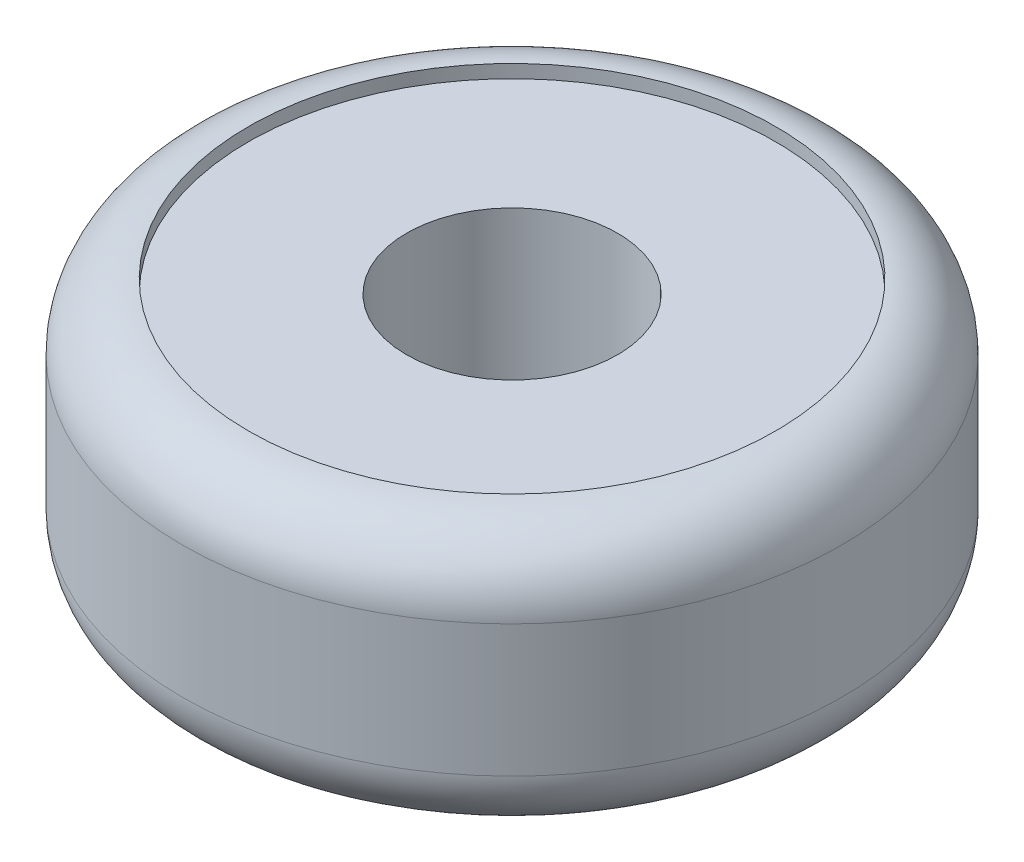
ISO-10303-21;
HEADER;
FILE_DESCRIPTION(('STEP AP214'),'2;1');
FILE_NAME('part.step','',(''),(''),'','','');
FILE_SCHEMA(('AUTOMOTIVE_DESIGN { 1 0 10303 214 1 1 1 1 }'));
ENDSEC;
DATA;
#1=APPLICATION_CONTEXT('core data for automotive mechanical design processes');
#2=APPLICATION_PROTOCOL_DEFINITION('international standard','automotive_design',2000,#1);
#3=PRODUCT_CONTEXT('',#1,'mechanical');
#4=PRODUCT('Part','Part','',(#3));
#5=PRODUCT_RELATED_PRODUCT_CATEGORY('part','',(#4));
#6=PRODUCT_DEFINITION_FORMATION('','',#4);
#7=PRODUCT_DEFINITION_CONTEXT('part definition',#1,'design');
#8=PRODUCT_DEFINITION('design','',#6,#7);
#9=PRODUCT_DEFINITION_SHAPE('','',#8);
#10=(LENGTH_UNIT() NAMED_UNIT(*) SI_UNIT(.MILLI.,.METRE.));
#11=(NAMED_UNIT(*) PLANE_ANGLE_UNIT() SI_UNIT($,.RADIAN.));
#12=(NAMED_UNIT(*) SI_UNIT($,.STERADIAN.) SOLID_ANGLE_UNIT());
#13=UNCERTAINTY_MEASURE_WITH_UNIT(LENGTH_MEASURE(1.E-05),#10,'distance_accuracy_value','');
#14=(GEOMETRIC_REPRESENTATION_CONTEXT(3) GLOBAL_UNCERTAINTY_ASSIGNED_CONTEXT((#13)) GLOBAL_UNIT_ASSIGNED_CONTEXT((#10,
#11,#12)) REPRESENTATION_CONTEXT('',''));
#15=CARTESIAN_POINT('',(0.,0.,0.));
#16=DIRECTION('',(0.,0.,1.));
#17=DIRECTION('',(1.,0.,0.));
#18=AXIS2_PLACEMENT_3D('',#15,#16,#17);
#19=CARTESIAN_POINT('',(0.,1.8,0.));
#20=DIRECTION('',(0.,1.,0.));
#21=DIRECTION('',(0.,0.,1.));
#22=AXIS2_PLACEMENT_3D('',#19,#20,#21);
#23=PLANE('',#22);
#24=CARTESIAN_POINT('',(0.,1.8,0.));
#25=DIRECTION('',(0.,1.,0.));
#26=DIRECTION('',(0.,0.,1.));
#27=AXIS2_PLACEMENT_3D('',#24,#25,#26);
#28=CIRCLE('',#27,4.);
#29=CARTESIAN_POINT('',(0.,1.8,4.));
#30=VERTEX_POINT('',#29);
#31=EDGE_CURVE('E53',#30,#30,#28,.F.);
#32=ORIENTED_EDGE('',*,*,#31,.F.);
#33=EDGE_LOOP('',(#32));
#34=FACE_BOUND('',#33,.T.);
#35=CARTESIAN_POINT('',(0.,1.8,0.));
#36=DIRECTION('',(0.,1.,0.));
#37=DIRECTION('',(0.,0.,1.));
#38=AXIS2_PLACEMENT_3D('',#35,#36,#37);
#39=CIRCLE('',#38,1.6);
#40=CARTESIAN_POINT('',(0.,1.8,1.6));
#41=VERTEX_POINT('',#40);
#42=EDGE_CURVE('E47',#41,#41,#39,.T.);
#43=ORIENTED_EDGE('',*,*,#42,.F.);
#44=EDGE_LOOP('',(#43));
#45=FACE_BOUND('',#44,.T.);
#46=ADVANCED_FACE('F32',(#34,#45),#23,.T.);
#47=CARTESIAN_POINT('',(0.,-1.8,0.));
#48=DIRECTION('',(0.,1.,0.));
#49=DIRECTION('',(0.,0.,1.));
#50=AXIS2_PLACEMENT_3D('',#47,#48,#49);
#51=PLANE('',#50);
#52=CARTESIAN_POINT('',(0.,-1.8,0.));
#53=DIRECTION('',(0.,1.,0.));
#54=DIRECTION('',(0.,0.,1.));
#55=AXIS2_PLACEMENT_3D('',#52,#53,#54);
#56=CIRCLE('',#55,4.);
#57=CARTESIAN_POINT('',(0.,-1.8,4.));
#58=VERTEX_POINT('',#57);
#59=EDGE_CURVE('E43',#58,#58,#56,.T.);
#60=ORIENTED_EDGE('',*,*,#59,.F.);
#61=EDGE_LOOP('',(#60));
#62=FACE_BOUND('',#61,.T.);
#63=CARTESIAN_POINT('',(0.,-1.8,0.));
#64=DIRECTION('',(0.,1.,0.));
#65=DIRECTION('',(0.,0.,1.));
#66=AXIS2_PLACEMENT_3D('',#63,#64,#65);
#67=CIRCLE('',#66,1.6);
#68=CARTESIAN_POINT('',(0.,-1.8,1.6));
#69=VERTEX_POINT('',#68);
#70=EDGE_CURVE('E50',#69,#69,#67,.T.);
#71=ORIENTED_EDGE('',*,*,#70,.T.);
#72=EDGE_LOOP('',(#71));
#73=FACE_BOUND('',#72,.T.);
#74=ADVANCED_FACE('F75',(#62,#73),#51,.F.);
#75=CARTESIAN_POINT('',(0.,1.8,0.));
#76=DIRECTION('',(0.,-1.,0.));
#77=DIRECTION('',(0.,0.,-1.));
#78=AXIS2_PLACEMENT_3D('',#75,#76,#77);
#79=CYLINDRICAL_SURFACE('',#78,1.6);
#80=ORIENTED_EDGE('',*,*,#42,.T.);
#81=EDGE_LOOP('',(#80));
#82=FACE_BOUND('',#81,.T.);
#83=ORIENTED_EDGE('',*,*,#70,.F.);
#84=EDGE_LOOP('',(#83));
#85=FACE_BOUND('',#84,.T.);
#86=ADVANCED_FACE('F81',(#82,#85),#79,.F.);
#87=CARTESIAN_POINT('',(0.,2.,0.));
#88=DIRECTION('',(0.,-1.,0.));
#89=DIRECTION('',(0.,0.,-1.));
#90=AXIS2_PLACEMENT_3D('',#87,#88,#89);
#91=CYLINDRICAL_SURFACE('',#90,4.);
#92=CARTESIAN_POINT('',(0.,-2.,0.));
#93=DIRECTION('',(0.,1.,0.));
#94=DIRECTION('',(0.,0.,1.));
#95=AXIS2_PLACEMENT_3D('',#92,#93,#94);
#96=CIRCLE('',#95,4.);
#97=CARTESIAN_POINT('',(0.,-2.,4.));
#98=VERTEX_POINT('',#97);
#99=EDGE_CURVE('E59',#98,#98,#96,.T.);
#100=ORIENTED_EDGE('',*,*,#99,.F.);
#101=EDGE_LOOP('',(#100));
#102=FACE_BOUND('',#101,.T.);
#103=ORIENTED_EDGE('',*,*,#59,.T.);
#104=EDGE_LOOP('',(#103));
#105=FACE_BOUND('',#104,.T.);
#106=ADVANCED_FACE('F89',(#102,#105),#91,.F.);
#107=CARTESIAN_POINT('',(0.,2.,0.));
#108=DIRECTION('',(0.,-1.,0.));
#109=DIRECTION('',(0.,0.,-1.));
#110=AXIS2_PLACEMENT_3D('',#107,#108,#109);
#111=CYLINDRICAL_SURFACE('',#110,5.);
#112=CARTESIAN_POINT('',(0.,-1.,0.));
#113=DIRECTION('',(0.,1.,0.));
#114=DIRECTION('',(0.,0.,1.));
#115=AXIS2_PLACEMENT_3D('',#112,#113,#114);
#116=CIRCLE('',#115,5.);
#117=CARTESIAN_POINT('',(0.,-1.,5.));
#118=VERTEX_POINT('',#117);
#119=EDGE_CURVE('E10',#118,#118,#116,.T.);
#120=ORIENTED_EDGE('',*,*,#119,.T.);
#121=EDGE_LOOP('',(#120));
#122=FACE_BOUND('',#121,.T.);
#123=CARTESIAN_POINT('',(0.,1.,0.));
#124=DIRECTION('',(0.,1.,0.));
#125=DIRECTION('',(0.,0.,1.));
#126=AXIS2_PLACEMENT_3D('',#123,#124,#125);
#127=CIRCLE('',#126,5.);
#128=CARTESIAN_POINT('',(0.,1.,5.));
#129=VERTEX_POINT('',#128);
#130=EDGE_CURVE('E39',#129,#129,#127,.F.);
#131=ORIENTED_EDGE('',*,*,#130,.T.);
#132=EDGE_LOOP('',(#131));
#133=FACE_BOUND('',#132,.T.);
#134=ADVANCED_FACE('F91',(#122,#133),#111,.T.);
#135=ORIENTED_EDGE('',*,*,#31,.T.);
#136=EDGE_LOOP('',(#135));
#137=FACE_BOUND('',#136,.T.);
#138=CARTESIAN_POINT('',(0.,2.,0.));
#139=DIRECTION('',(0.,1.,0.));
#140=DIRECTION('',(0.,0.,1.));
#141=AXIS2_PLACEMENT_3D('',#138,#139,#140);
#142=CIRCLE('',#141,4.);
#143=CARTESIAN_POINT('',(0.,2.,4.));
#144=VERTEX_POINT('',#143);
#145=EDGE_CURVE('E58',#144,#144,#142,.T.);
#146=ORIENTED_EDGE('',*,*,#145,.T.);
#147=EDGE_LOOP('',(#146));
#148=FACE_BOUND('',#147,.T.);
#149=ADVANCED_FACE('F65',(#137,#148),#91,.F.);
#150=CARTESIAN_POINT('',(0.,-1.,0.));
#151=DIRECTION('',(0.,1.,0.));
#152=DIRECTION('',(0.,0.,1.));
#153=AXIS2_PLACEMENT_3D('',#150,#151,#152);
#154=TOROIDAL_SURFACE('',#153,4.,1.);
#155=ORIENTED_EDGE('',*,*,#99,.T.);
#156=EDGE_LOOP('',(#155));
#157=FACE_BOUND('',#156,.T.);
#158=ORIENTED_EDGE('',*,*,#119,.F.);
#159=EDGE_LOOP('',(#158));
#160=FACE_BOUND('',#159,.T.);
#161=ADVANCED_FACE('F68',(#157,#160),#154,.T.);
#162=CARTESIAN_POINT('',(0.,1.,0.));
#163=DIRECTION('',(0.,1.,0.));
#164=DIRECTION('',(0.,0.,1.));
#165=AXIS2_PLACEMENT_3D('',#162,#163,#164);
#166=TOROIDAL_SURFACE('',#165,4.,1.);
#167=ORIENTED_EDGE('',*,*,#130,.F.);
#168=EDGE_LOOP('',(#167));
#169=FACE_BOUND('',#168,.T.);
#170=ORIENTED_EDGE('',*,*,#145,.F.);
#171=EDGE_LOOP('',(#170));
#172=FACE_BOUND('',#171,.T.);
#173=ADVANCED_FACE('F34',(#169,#172),#166,.T.);
#174=CLOSED_SHELL('',(#46,#74,#86,#106,#134,#149,#161,#173));
#175=MANIFOLD_SOLID_BREP('B2',#174);
#176=ADVANCED_BREP_SHAPE_REPRESENTATION('',(#18,#175),#14);
#177=SHAPE_DEFINITION_REPRESENTATION(#9,#176);
ENDSEC;
END-ISO-10303-21;
